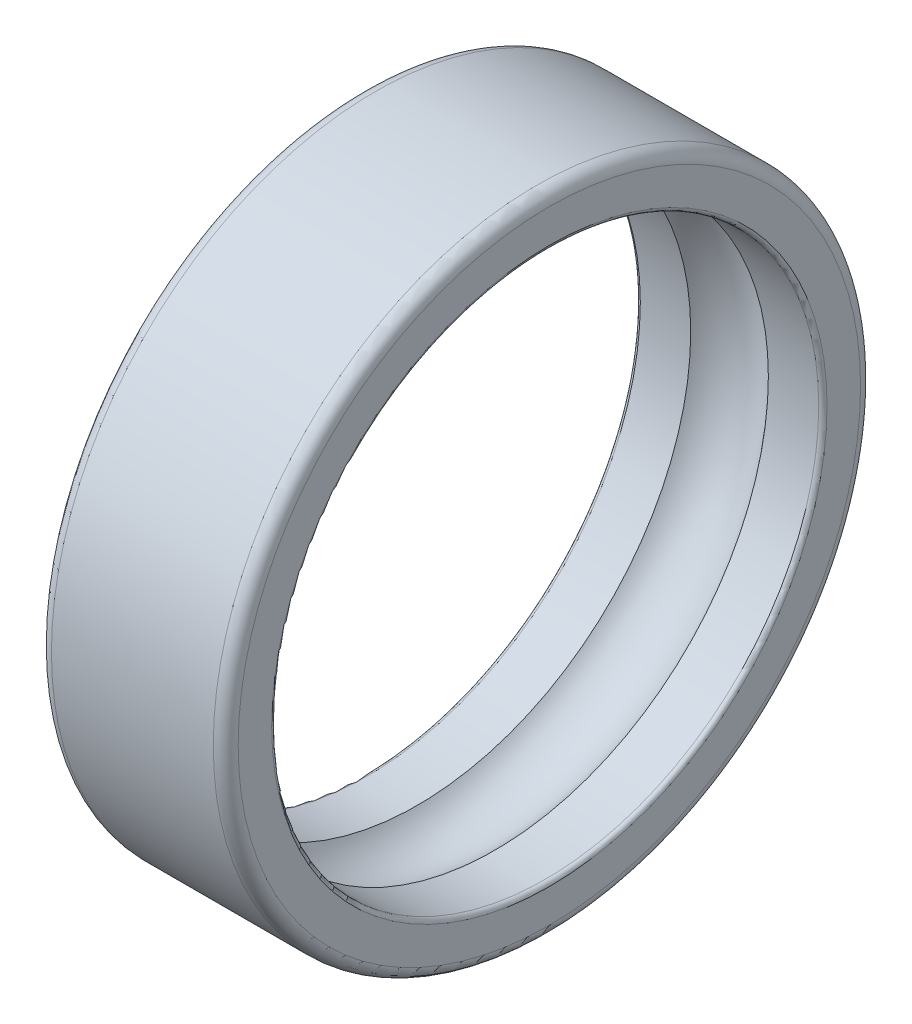
ISO-10303-21;
HEADER;
FILE_DESCRIPTION(('STEP AP214'),'2;1');
FILE_NAME('part.step','',(''),(''),'','','');
FILE_SCHEMA(('AUTOMOTIVE_DESIGN { 1 0 10303 214 1 1 1 1 }'));
ENDSEC;
DATA;
#1=APPLICATION_CONTEXT('core data for automotive mechanical design processes');
#2=APPLICATION_PROTOCOL_DEFINITION('international standard','automotive_design',2000,#1);
#3=PRODUCT_CONTEXT('',#1,'mechanical');
#4=PRODUCT('Part','Part','',(#3));
#5=PRODUCT_RELATED_PRODUCT_CATEGORY('part','',(#4));
#6=PRODUCT_DEFINITION_FORMATION('','',#4);
#7=PRODUCT_DEFINITION_CONTEXT('part definition',#1,'design');
#8=PRODUCT_DEFINITION('design','',#6,#7);
#9=PRODUCT_DEFINITION_SHAPE('','',#8);
#10=(LENGTH_UNIT() NAMED_UNIT(*) SI_UNIT(.MILLI.,.METRE.));
#11=(NAMED_UNIT(*) PLANE_ANGLE_UNIT() SI_UNIT($,.RADIAN.));
#12=(NAMED_UNIT(*) SI_UNIT($,.STERADIAN.) SOLID_ANGLE_UNIT());
#13=UNCERTAINTY_MEASURE_WITH_UNIT(LENGTH_MEASURE(1.E-05),#10,'distance_accuracy_value','');
#14=(GEOMETRIC_REPRESENTATION_CONTEXT(3) GLOBAL_UNCERTAINTY_ASSIGNED_CONTEXT((#13)) GLOBAL_UNIT_ASSIGNED_CONTEXT((#10,
#11,#12)) REPRESENTATION_CONTEXT('',''));
#15=CARTESIAN_POINT('',(0.,0.,0.));
#16=DIRECTION('',(0.,0.,1.));
#17=DIRECTION('',(1.,0.,0.));
#18=AXIS2_PLACEMENT_3D('',#15,#16,#17);
#19=CARTESIAN_POINT('',(0.,-25.4644085935696,-25.));
#20=DIRECTION('',(-1.,0.,0.));
#21=DIRECTION('',(0.,0.,1.));
#22=AXIS2_PLACEMENT_3D('',#19,#20,#21);
#23=PLANE('',#22);
#24=CARTESIAN_POINT('',(0.,0.,0.));
#25=DIRECTION('',(-1.,0.,0.));
#26=DIRECTION('',(0.,0.,-1.));
#27=AXIS2_PLACEMENT_3D('',#24,#25,#26);
#28=CIRCLE('',#27,25.);
#29=CARTESIAN_POINT('',(0.,0.,-25.));
#30=VERTEX_POINT('',#29);
#31=EDGE_CURVE('E49',#30,#30,#28,.F.);
#32=ORIENTED_EDGE('',*,*,#31,.F.);
#33=EDGE_LOOP('',(#32));
#34=FACE_BOUND('',#33,.T.);
#35=CARTESIAN_POINT('',(0.,0.,0.));
#36=DIRECTION('',(1.,0.,0.));
#37=DIRECTION('',(0.,0.,1.));
#38=AXIS2_PLACEMENT_3D('',#35,#36,#37);
#39=CIRCLE('',#38,22.3083333333336);
#40=CARTESIAN_POINT('',(0.,0.,22.3083333333336));
#41=VERTEX_POINT('',#40);
#42=EDGE_CURVE('E46',#41,#41,#39,.T.);
#43=ORIENTED_EDGE('',*,*,#42,.T.);
#44=EDGE_LOOP('',(#43));
#45=FACE_BOUND('',#44,.T.);
#46=ADVANCED_FACE('F14',(#34,#45),#23,.T.);
#47=CARTESIAN_POINT('',(15.,-25.4644085500745,25.));
#48=DIRECTION('',(1.,0.,0.));
#49=DIRECTION('',(0.,0.,-1.));
#50=AXIS2_PLACEMENT_3D('',#47,#48,#49);
#51=PLANE('',#50);
#52=CARTESIAN_POINT('',(15.,0.,0.));
#53=DIRECTION('',(1.,0.,0.));
#54=DIRECTION('',(0.,-1.16851722964384E-09,1.));
#55=AXIS2_PLACEMENT_3D('',#52,#53,#54);
#56=CIRCLE('',#55,25.);
#57=CARTESIAN_POINT('',(15.,-2.9212930741096E-08,25.));
#58=VERTEX_POINT('',#57);
#59=EDGE_CURVE('E43',#58,#58,#56,.T.);
#60=ORIENTED_EDGE('',*,*,#59,.T.);
#61=EDGE_LOOP('',(#60));
#62=FACE_BOUND('',#61,.T.);
#63=CARTESIAN_POINT('',(15.,0.,0.));
#64=DIRECTION('',(-1.,0.,0.));
#65=DIRECTION('',(0.,0.,-1.));
#66=AXIS2_PLACEMENT_3D('',#63,#64,#65);
#67=CIRCLE('',#66,22.308333333333);
#68=CARTESIAN_POINT('',(15.,0.,-22.308333333333));
#69=VERTEX_POINT('',#68);
#70=EDGE_CURVE('E40',#69,#69,#67,.F.);
#71=ORIENTED_EDGE('',*,*,#70,.F.);
#72=EDGE_LOOP('',(#71));
#73=FACE_BOUND('',#72,.T.);
#74=ADVANCED_FACE('F58',(#62,#73),#51,.T.);
#75=CARTESIAN_POINT('',(0.999999999999226,0.,0.));
#76=DIRECTION('',(1.,0.,0.));
#77=DIRECTION('',(0.,0.,1.));
#78=AXIS2_PLACEMENT_3D('',#75,#76,#77);
#79=TOROIDAL_SURFACE('',#78,25.0000000000008,0.999999999999224);
#80=ORIENTED_EDGE('',*,*,#31,.T.);
#81=EDGE_LOOP('',(#80));
#82=FACE_BOUND('',#81,.T.);
#83=CARTESIAN_POINT('',(0.999999999999226,0.,0.));
#84=DIRECTION('',(-1.,0.,0.));
#85=DIRECTION('',(0.,0.,-1.));
#86=AXIS2_PLACEMENT_3D('',#83,#84,#85);
#87=CIRCLE('',#86,26.);
#88=CARTESIAN_POINT('',(0.999999999999226,0.,-26.));
#89=VERTEX_POINT('',#88);
#90=EDGE_CURVE('E37',#89,#89,#87,.F.);
#91=ORIENTED_EDGE('',*,*,#90,.F.);
#92=EDGE_LOOP('',(#91));
#93=FACE_BOUND('',#92,.T.);
#94=ADVANCED_FACE('F53',(#82,#93),#79,.T.);
#95=CARTESIAN_POINT('',(0.333333333333644,0.,0.));
#96=DIRECTION('',(1.,0.,0.));
#97=DIRECTION('',(0.,0.,1.));
#98=AXIS2_PLACEMENT_3D('',#95,#96,#97);
#99=TOROIDAL_SURFACE('',#98,22.3083333333336,0.333333333333644);
#100=CARTESIAN_POINT('',(0.333333333333332,0.,0.));
#101=DIRECTION('',(1.,0.,0.));
#102=DIRECTION('',(0.,0.,1.));
#103=AXIS2_PLACEMENT_3D('',#100,#101,#102);
#104=CIRCLE('',#103,21.975);
#105=CARTESIAN_POINT('',(0.333333333333332,0.,21.975));
#106=VERTEX_POINT('',#105);
#107=EDGE_CURVE('E34',#106,#106,#104,.T.);
#108=ORIENTED_EDGE('',*,*,#107,.T.);
#109=EDGE_LOOP('',(#108));
#110=FACE_BOUND('',#109,.T.);
#111=ORIENTED_EDGE('',*,*,#42,.F.);
#112=EDGE_LOOP('',(#111));
#113=FACE_BOUND('',#112,.T.);
#114=ADVANCED_FACE('F62',(#110,#113),#99,.T.);
#115=CARTESIAN_POINT('',(50.,0.,0.));
#116=DIRECTION('',(1.,0.,0.));
#117=DIRECTION('',(0.,0.,1.));
#118=AXIS2_PLACEMENT_3D('',#115,#116,#117);
#119=CYLINDRICAL_SURFACE('',#118,21.975);
#120=CARTESIAN_POINT('',(4.3813567052322,0.,0.));
#121=DIRECTION('',(1.,0.,0.));
#122=DIRECTION('',(0.,0.,1.));
#123=AXIS2_PLACEMENT_3D('',#120,#121,#122);
#124=CIRCLE('',#123,21.975);
#125=CARTESIAN_POINT('',(4.3813567052322,0.,21.975));
#126=VERTEX_POINT('',#125);
#127=EDGE_CURVE('E29',#126,#126,#124,.T.);
#128=ORIENTED_EDGE('',*,*,#127,.T.);
#129=EDGE_LOOP('',(#128));
#130=FACE_BOUND('',#129,.T.);
#131=ORIENTED_EDGE('',*,*,#107,.F.);
#132=EDGE_LOOP('',(#131));
#133=FACE_BOUND('',#132,.T.);
#134=ADVANCED_FACE('F64',(#130,#133),#119,.F.);
#135=CARTESIAN_POINT('',(7.5000000000001,0.,0.));
#136=DIRECTION('',(1.,0.,0.));
#137=DIRECTION('',(0.,0.,1.));
#138=AXIS2_PLACEMENT_3D('',#135,#136,#137);
#139=TOROIDAL_SURFACE('',#138,19.5199999999998,3.96900000000026);
#140=ORIENTED_EDGE('',*,*,#127,.F.);
#141=EDGE_LOOP('',(#140));
#142=FACE_BOUND('',#141,.T.);
#143=CARTESIAN_POINT('',(10.618643294768,0.,0.));
#144=DIRECTION('',(1.,0.,0.));
#145=DIRECTION('',(0.,-1.92337578856641E-10,1.));
#146=AXIS2_PLACEMENT_3D('',#143,#144,#145);
#147=CIRCLE('',#146,21.975);
#148=CARTESIAN_POINT('',(10.618643294768,-4.22661829537469E-09,21.975));
#149=VERTEX_POINT('',#148);
#150=EDGE_CURVE('E25',#149,#149,#147,.T.);
#151=ORIENTED_EDGE('',*,*,#150,.T.);
#152=EDGE_LOOP('',(#151));
#153=FACE_BOUND('',#152,.T.);
#154=ADVANCED_FACE('F72',(#142,#153),#139,.F.);
#155=CARTESIAN_POINT('',(50.,0.,0.));
#156=DIRECTION('',(1.,0.,0.));
#157=DIRECTION('',(0.,0.,1.));
#158=AXIS2_PLACEMENT_3D('',#155,#156,#157);
#159=CYLINDRICAL_SURFACE('',#158,21.975);
#160=CARTESIAN_POINT('',(14.666666666667,0.,0.));
#161=DIRECTION('',(1.,0.,0.));
#162=DIRECTION('',(0.,0.,1.));
#163=AXIS2_PLACEMENT_3D('',#160,#161,#162);
#164=CIRCLE('',#163,21.975);
#165=CARTESIAN_POINT('',(14.666666666667,0.,21.975));
#166=VERTEX_POINT('',#165);
#167=EDGE_CURVE('E21',#166,#166,#164,.T.);
#168=ORIENTED_EDGE('',*,*,#167,.T.);
#169=EDGE_LOOP('',(#168));
#170=FACE_BOUND('',#169,.T.);
#171=ORIENTED_EDGE('',*,*,#150,.F.);
#172=EDGE_LOOP('',(#171));
#173=FACE_BOUND('',#172,.T.);
#174=ADVANCED_FACE('F80',(#170,#173),#159,.F.);
#175=CARTESIAN_POINT('',(14.666666666666,0.,0.));
#176=DIRECTION('',(1.,0.,0.));
#177=DIRECTION('',(0.,0.,1.));
#178=AXIS2_PLACEMENT_3D('',#175,#176,#177);
#179=TOROIDAL_SURFACE('',#178,22.308333333334,0.333333333333956);
#180=ORIENTED_EDGE('',*,*,#70,.T.);
#181=EDGE_LOOP('',(#180));
#182=FACE_BOUND('',#181,.T.);
#183=ORIENTED_EDGE('',*,*,#167,.F.);
#184=EDGE_LOOP('',(#183));
#185=FACE_BOUND('',#184,.T.);
#186=ADVANCED_FACE('F84',(#182,#185),#179,.T.);
#187=CARTESIAN_POINT('',(14.0000000000015,0.,0.));
#188=DIRECTION('',(1.,0.,0.));
#189=DIRECTION('',(0.,0.,1.));
#190=AXIS2_PLACEMENT_3D('',#187,#188,#189);
#191=TOROIDAL_SURFACE('',#190,25.0000000000015,0.999999999998454);
#192=CARTESIAN_POINT('',(14.0000000000015,0.,0.));
#193=DIRECTION('',(1.,0.,0.));
#194=DIRECTION('',(0.,0.,1.));
#195=AXIS2_PLACEMENT_3D('',#192,#193,#194);
#196=CIRCLE('',#195,26.);
#197=CARTESIAN_POINT('',(14.0000000000015,0.,26.));
#198=VERTEX_POINT('',#197);
#199=EDGE_CURVE('E9',#198,#198,#196,.T.);
#200=ORIENTED_EDGE('',*,*,#199,.T.);
#201=EDGE_LOOP('',(#200));
#202=FACE_BOUND('',#201,.T.);
#203=ORIENTED_EDGE('',*,*,#59,.F.);
#204=EDGE_LOOP('',(#203));
#205=FACE_BOUND('',#204,.T.);
#206=ADVANCED_FACE('F86',(#202,#205),#191,.T.);
#207=CARTESIAN_POINT('',(50.,0.,0.));
#208=DIRECTION('',(1.,0.,0.));
#209=DIRECTION('',(0.,0.,1.));
#210=AXIS2_PLACEMENT_3D('',#207,#208,#209);
#211=CYLINDRICAL_SURFACE('',#210,26.);
#212=ORIENTED_EDGE('',*,*,#90,.T.);
#213=EDGE_LOOP('',(#212));
#214=FACE_BOUND('',#213,.T.);
#215=ORIENTED_EDGE('',*,*,#199,.F.);
#216=EDGE_LOOP('',(#215));
#217=FACE_BOUND('',#216,.T.);
#218=ADVANCED_FACE('F16',(#214,#217),#211,.T.);
#219=CLOSED_SHELL('',(#46,#74,#94,#114,#134,#154,#174,#186,#206,#218));
#220=MANIFOLD_SOLID_BREP('B1',#219);
#221=ADVANCED_BREP_SHAPE_REPRESENTATION('',(#18,#220),#14);
#222=SHAPE_DEFINITION_REPRESENTATION(#9,#221);
ENDSEC;
END-ISO-10303-21;
